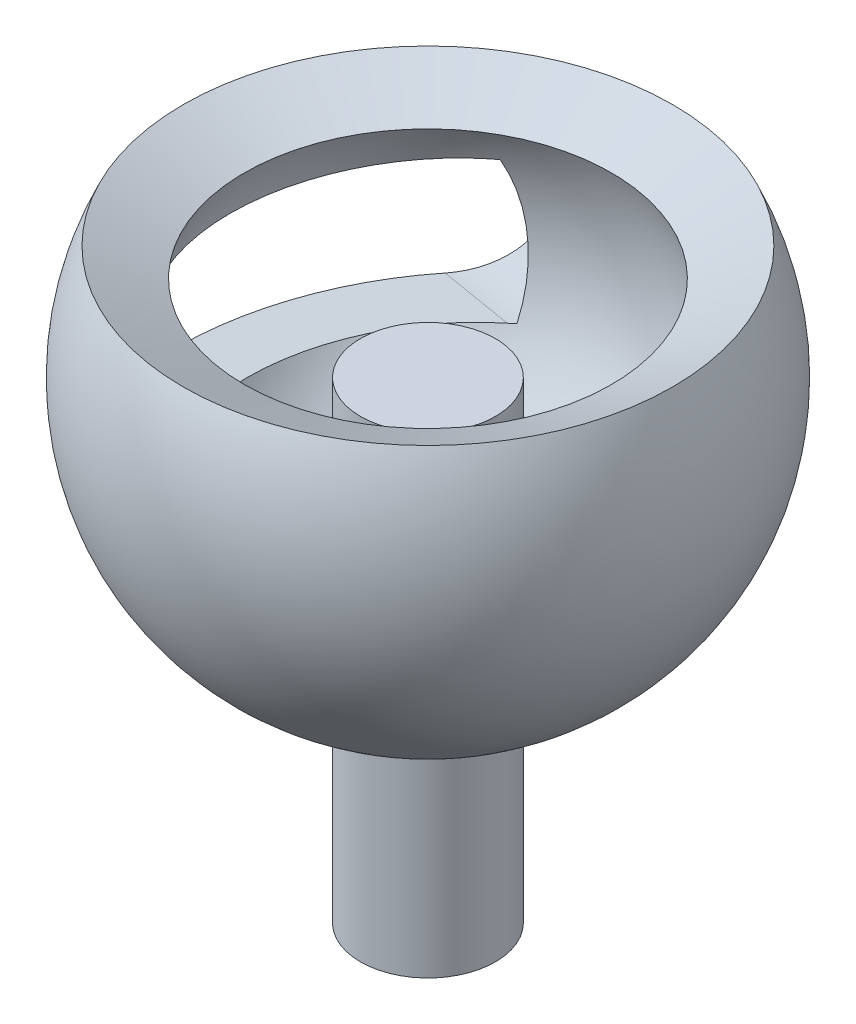
ISO-10303-21;
HEADER;
FILE_DESCRIPTION(('STEP AP214'),'2;1');
FILE_NAME('part.step','',(''),(''),'','','');
FILE_SCHEMA(('AUTOMOTIVE_DESIGN { 1 0 10303 214 1 1 1 1 }'));
ENDSEC;
DATA;
#1=APPLICATION_CONTEXT('core data for automotive mechanical design processes');
#2=APPLICATION_PROTOCOL_DEFINITION('international standard','automotive_design',2000,#1);
#3=PRODUCT_CONTEXT('',#1,'mechanical');
#4=PRODUCT('Part','Part','',(#3));
#5=PRODUCT_RELATED_PRODUCT_CATEGORY('part','',(#4));
#6=PRODUCT_DEFINITION_FORMATION('','',#4);
#7=PRODUCT_DEFINITION_CONTEXT('part definition',#1,'design');
#8=PRODUCT_DEFINITION('design','',#6,#7);
#9=PRODUCT_DEFINITION_SHAPE('','',#8);
#10=(LENGTH_UNIT() NAMED_UNIT(*) SI_UNIT(.MILLI.,.METRE.));
#11=(NAMED_UNIT(*) PLANE_ANGLE_UNIT() SI_UNIT($,.RADIAN.));
#12=(NAMED_UNIT(*) SI_UNIT($,.STERADIAN.) SOLID_ANGLE_UNIT());
#13=UNCERTAINTY_MEASURE_WITH_UNIT(LENGTH_MEASURE(1.E-05),#10,'distance_accuracy_value','');
#14=(GEOMETRIC_REPRESENTATION_CONTEXT(3) GLOBAL_UNCERTAINTY_ASSIGNED_CONTEXT((#13)) GLOBAL_UNIT_ASSIGNED_CONTEXT((#10,
#11,#12)) REPRESENTATION_CONTEXT('',''));
#15=CARTESIAN_POINT('',(0.,0.,0.));
#16=DIRECTION('',(0.,0.,1.));
#17=DIRECTION('',(1.,0.,0.));
#18=AXIS2_PLACEMENT_3D('',#15,#16,#17);
#19=CARTESIAN_POINT('',(0.,0.,0.));
#20=DIRECTION('',(0.,1.,0.));
#21=DIRECTION('',(1.,0.,0.));
#22=AXIS2_PLACEMENT_3D('',#19,#20,#21);
#23=SPHERICAL_SURFACE('',#22,6.);
#24=CARTESIAN_POINT('',(-2.62167369861936,-2.3424846293305,-4.86205643522551));
#25=CARTESIAN_POINT('',(-2.57683275353672,-2.33793647134456,-4.88842684763844));
#26=CARTESIAN_POINT('',(-2.53192803712261,-2.3323285090776,-4.91450016644448));
#27=CARTESIAN_POINT('',(-2.44210939386938,-2.31909401395078,-4.96594618772946));
#28=CARTESIAN_POINT('',(-2.39719559201061,-2.31147066182376,-4.99131992522537));
#29=CARTESIAN_POINT('',(-2.30733717378224,-2.29429178422087,-5.0413429190142));
#30=CARTESIAN_POINT('',(-2.26239255816846,-2.28473630455975,-5.06599219246979));
#31=CARTESIAN_POINT('',(-2.17244104196638,-2.26376357330472,-5.11454805890817));
#32=CARTESIAN_POINT('',(-2.12743415447295,-2.25234341999982,-5.13845342410275));
#33=CARTESIAN_POINT('',(-2.0824516416394,-2.24004140477855,-5.16193855689034));
#34=B_SPLINE_CURVE_WITH_KNOTS('',3,(#24,#25,#26,#27,#28,#29,#30,#31,#32,#33),.UNSPECIFIED.,.F.,
.F.,(4,2,2,2,4),(0.,0.156640281688716,0.313034810921426,0.469425632150523,0.626062181831317),.UNSPECIFIED.);
#35=CARTESIAN_POINT('',(-2.5533300558906,-2.33474380231328,-4.90198704641755));
#36=VERTEX_POINT('',#35);
#37=CARTESIAN_POINT('',(-2.36885059175089,-2.30600792023142,-5.00708241851394));
#38=VERTEX_POINT('',#37);
#39=EDGE_CURVE('E95',#36,#38,#34,.T.);
#40=ORIENTED_EDGE('',*,*,#39,.F.);
#41=CARTESIAN_POINT('',(0.248078612385995,-1.984554610505,0.));
#42=DIRECTION('',(0.124039306192997,-0.992277305252498,0.));
#43=DIRECTION('',(0.992277305252498,0.124039306192997,0.));
#44=AXIS2_PLACEMENT_3D('',#41,#42,#43);
#45=CIRCLE('',#44,5.65685424949238);
#46=CARTESIAN_POINT('',(-4.61605188441586,-2.59259368270969,2.82321146865667));
#47=VERTEX_POINT('',#46);
#48=EDGE_CURVE('E82',#47,#36,#45,.T.);
#49=ORIENTED_EDGE('',*,*,#48,.F.);
#50=CARTESIAN_POINT('',(-4.4693442193253,-2.56375979272113,3.07442644641404));
#51=CARTESIAN_POINT('',(-4.51198223146642,-2.5750277431296,3.00304346858877));
#52=CARTESIAN_POINT('',(-4.55414825488242,-2.58378865696318,2.93100553495964));
#53=CARTESIAN_POINT('',(-4.6375728451934,-2.59593490315072,2.78587535304215));
#54=CARTESIAN_POINT('',(-4.67883056843072,-2.59931542991384,2.71278222100469));
#55=CARTESIAN_POINT('',(-4.80197171622592,-2.60082891893815,2.49107787800528));
#56=CARTESIAN_POINT('',(-4.88239774743434,-2.59010033691617,2.3414354305859));
#57=CARTESIAN_POINT('',(-5.03072702162718,-2.5445611714823,2.0591892981356));
#58=CARTESIAN_POINT('',(-5.09907094296285,-2.51231785246034,1.92640416983957));
#59=CARTESIAN_POINT('',(-5.23117201891643,-2.42453723895334,1.66713778518798));
#60=CARTESIAN_POINT('',(-5.29495438059619,-2.369141792985,1.54062330230016));
#61=CARTESIAN_POINT('',(-5.38981991142038,-2.26408426524728,1.35305763573868));
#62=CARTESIAN_POINT('',(-5.4227445388729,-2.22298322007234,1.28808340304517));
#63=CARTESIAN_POINT('',(-5.48690895696774,-2.13300637684664,1.1623890802866));
#64=CARTESIAN_POINT('',(-5.51814109091605,-2.08409865141308,1.10168800276022));
#65=CARTESIAN_POINT('',(-5.54835085632141,-2.0313188470059,1.04381344930794));
#66=B_SPLINE_CURVE_WITH_KNOTS('',3,(#50,#51,#52,#53,#54,#55,#56,#57,#58,#59,#60,#61,#62,#63,#64,
#65),.UNSPECIFIED.,.F.,.F.,(4,2,2,2,2,2,2,4),(0.,0.251632302239745,0.503489228586969,
1.01207278899626,1.46879476360035,1.92275858840497,2.17322778125711,2.42474889223318),.UNSPECIFIED.);
#67=CARTESIAN_POINT('',(-4.50891301326772,-2.57352573664173,3.00776806313713));
#68=VERTEX_POINT('',#67);
#69=EDGE_CURVE('E89',#68,#47,#66,.T.);
#70=ORIENTED_EDGE('',*,*,#69,.F.);
#71=CARTESIAN_POINT('',(-3.68626191744866,-0.460799988335568,-0.999657177688405));
#72=DIRECTION('',(-0.958192395634806,-0.119778533001622,-0.259846947220109));
#73=DIRECTION('',(-0.261731245703058,0.,0.965140795440088));
#74=AXIS2_PLACEMENT_3D('',#71,#72,#73);
#75=CIRCLE('',#74,4.6043264408395);
#76=CARTESIAN_POINT('',(-5.00367324314643,1.38440794356029,3.00776806313713));
#77=VERTEX_POINT('',#76);
#78=EDGE_CURVE('E34',#68,#77,#75,.T.);
#79=ORIENTED_EDGE('',*,*,#78,.T.);
#80=CARTESIAN_POINT('',(-5.87765487203645,0.603014666712204,1.04381344930795));
#81=CARTESIAN_POINT('',(-5.85020883766115,0.701838441194811,1.14143467568126));
#82=CARTESIAN_POINT('',(-5.81726149384555,0.790501199119532,1.24684899162035));
#83=CARTESIAN_POINT('',(-5.74192924146358,0.947223116031309,1.46708353672751));
#84=CARTESIAN_POINT('',(-5.69966119824299,1.01551470807885,1.58177703292805));
#85=CARTESIAN_POINT('',(-5.59578045140536,1.14717327683701,1.84413049345374));
#86=CARTESIAN_POINT('',(-5.53195464095308,1.20575011356224,1.99328091186678));
#87=CARTESIAN_POINT('',(-5.39240419307753,1.29772025804248,2.29519460044161));
#88=CARTESIAN_POINT('',(-5.31658365922568,1.3308968033695,2.44797774025803));
#89=CARTESIAN_POINT('',(-5.18008080793089,1.36751427442479,2.703866841102));
#90=CARTESIAN_POINT('',(-5.12205214503806,1.37700208116462,2.80760508826997));
#91=CARTESIAN_POINT('',(-5.0014840557169,1.38610426252,3.01298406744681));
#92=CARTESIAN_POINT('',(-4.93894110337153,1.38571083426945,3.11462307837695));
#93=CARTESIAN_POINT('',(-4.81062805948987,1.37604929011073,3.31333032781065));
#94=CARTESIAN_POINT('',(-4.74491637836498,1.36690722769587,3.41044296799464));
#95=CARTESIAN_POINT('',(-4.6098330365706,1.34081664374517,3.60075484565264));
#96=CARTESIAN_POINT('',(-4.54046799168121,1.3238818308014,3.693960642968));
#97=CARTESIAN_POINT('',(-4.4693442193256,1.30347494444054,3.78495909071692));
#98=B_SPLINE_CURVE_WITH_KNOTS('',3,(#80,#81,#82,#83,#84,#85,#86,#87,#88,#89,#90,#91,#92,#93,#94,
#95,#96,#97),.UNSPECIFIED.,.F.,.F.,(4,2,2,2,2,2,2,2,4),(0.,0.423156860718995,0.841282598925935,
1.35609216159077,1.87524751958704,2.23248928920844,2.59001316903957,2.94246207678071,
3.2942933315326),.UNSPECIFIED.);
#99=CARTESIAN_POINT('',(-5.11220910918785,1.3765155383003,2.82321146865667));
#100=VERTEX_POINT('',#99);
#101=EDGE_CURVE('E167',#100,#77,#98,.T.);
#102=ORIENTED_EDGE('',*,*,#101,.F.);
#103=CARTESIAN_POINT('',(-0.248078612385995,1.984554610505,0.));
#104=DIRECTION('',(-0.124039306192997,0.992277305252498,0.));
#105=DIRECTION('',(-0.992277305252498,-0.124039306192997,0.));
#106=AXIS2_PLACEMENT_3D('',#103,#104,#105);
#107=CIRCLE('',#106,5.65685424949238);
#108=CARTESIAN_POINT('',(-3.04948728066259,1.63436541869671,-4.90198704641755));
#109=VERTEX_POINT('',#108);
#110=EDGE_CURVE('E110',#109,#100,#107,.T.);
#111=ORIENTED_EDGE('',*,*,#110,.F.);
#112=CARTESIAN_POINT('',(-2.83024118372822,1.65392622405384,-5.02536196580064));
#113=CARTESIAN_POINT('',(-2.87878254259309,1.65129257484225,-4.99888980655007));
#114=CARTESIAN_POINT('',(-2.92700257259037,1.64756893056397,-4.97204493271159));
#115=CARTESIAN_POINT('',(-3.02279997485937,1.63794165187304,-4.91760975585337));
#116=CARTESIAN_POINT('',(-3.07037734713096,1.63203801745996,-4.89001945283347));
#117=CARTESIAN_POINT('',(-3.11763339053483,1.62504438797974,-4.86205643522552));
#118=B_SPLINE_CURVE_WITH_KNOTS('',3,(#112,#113,#114,#115,#116,#117),.UNSPECIFIED.,.F.,.F.,(4,2,
4),(0.,0.165943233183761,0.331886466400857),.UNSPECIFIED.);
#119=CARTESIAN_POINT('',(-2.86361082162961,1.65192575997059,-5.00708241851394));
#120=VERTEX_POINT('',#119);
#121=EDGE_CURVE('E105',#120,#109,#118,.T.);
#122=ORIENTED_EDGE('',*,*,#121,.F.);
#123=EDGE_CURVE('E11',#120,#38,#75,.T.);
#124=ORIENTED_EDGE('',*,*,#123,.T.);
#125=EDGE_LOOP('',(#40,#49,#70,#79,#102,#111,#122,#124));
#126=FACE_BOUND('',#125,.T.);
#127=CARTESIAN_POINT('',(0.,-5.65685424949238,0.));
#128=DIRECTION('',(0.,1.,0.));
#129=DIRECTION('',(0.,0.,1.));
#130=AXIS2_PLACEMENT_3D('',#127,#128,#129);
#131=CIRCLE('',#130,2.);
#132=CARTESIAN_POINT('',(0.,-5.65685424949238,2.));
#133=VERTEX_POINT('',#132);
#134=EDGE_CURVE('E218',#133,#133,#131,.T.);
#135=ORIENTED_EDGE('',*,*,#134,.F.);
#136=EDGE_LOOP('',(#135));
#137=FACE_BOUND('',#136,.T.);
#138=CARTESIAN_POINT('',(0.,2.53570957044419,0.));
#139=DIRECTION('',(0.,1.,0.));
#140=DIRECTION('',(0.,0.,1.));
#141=AXIS2_PLACEMENT_3D('',#138,#139,#140);
#142=CIRCLE('',#141,5.4378467222199);
#143=CARTESIAN_POINT('',(0.,2.53570957044419,5.4378467222199));
#144=VERTEX_POINT('',#143);
#145=EDGE_CURVE('E213',#144,#144,#142,.T.);
#146=ORIENTED_EDGE('',*,*,#145,.T.);
#147=EDGE_LOOP('',(#146));
#148=FACE_BOUND('',#147,.T.);
#149=ADVANCED_FACE('F30',(#126,#137,#148),#23,.F.);
#150=CARTESIAN_POINT('',(0.,2.53570957044419,0.));
#151=DIRECTION('',(0.,1.,0.));
#152=DIRECTION('',(0.,0.,1.));
#153=AXIS2_PLACEMENT_3D('',#150,#151,#152);
#154=CONICAL_SURFACE('',#153,5.4378467222199,1.13446401379632);
#155=CARTESIAN_POINT('',(0.,3.38094609392559,0.));
#156=DIRECTION('',(0.,1.,0.));
#157=DIRECTION('',(0.,0.,1.));
#158=AXIS2_PLACEMENT_3D('',#155,#156,#157);
#159=CIRCLE('',#158,7.25046229629321);
#160=CARTESIAN_POINT('',(0.,3.38094609392559,7.25046229629321));
#161=VERTEX_POINT('',#160);
#162=EDGE_CURVE('E210',#161,#161,#159,.T.);
#163=ORIENTED_EDGE('',*,*,#162,.T.);
#164=EDGE_LOOP('',(#163));
#165=FACE_BOUND('',#164,.T.);
#166=ORIENTED_EDGE('',*,*,#145,.F.);
#167=EDGE_LOOP('',(#166));
#168=FACE_BOUND('',#167,.T.);
#169=ADVANCED_FACE('F143',(#165,#168),#154,.F.);
#170=CARTESIAN_POINT('',(0.,0.,0.));
#171=DIRECTION('',(0.,1.,0.));
#172=DIRECTION('',(-1.,0.,0.));
#173=AXIS2_PLACEMENT_3D('',#170,#171,#172);
#174=SPHERICAL_SURFACE('',#173,8.);
#175=CARTESIAN_POINT('',(-6.27027160707574,1.02181270014713,-4.86205643522551));
#176=CARTESIAN_POINT('',(-6.21983922596498,1.0625291980412,-4.91853759971496));
#177=CARTESIAN_POINT('',(-6.1674823210125,1.09920992402776,-4.97606924910927));
#178=CARTESIAN_POINT('',(-6.05948490672703,1.16447325683609,-5.09254589186676));
#179=CARTESIAN_POINT('',(-6.00384668199067,1.19306141946561,-5.15148988530836));
#180=CARTESIAN_POINT('',(-5.8334357381382,1.26642705261333,-5.32881456663511));
#181=CARTESIAN_POINT('',(-5.71454648756449,1.29929543472618,-5.44838376853232));
#182=CARTESIAN_POINT('',(-5.48970293245135,1.33068571821239,-5.66686133364708));
#183=CARTESIAN_POINT('',(-5.38462196089303,1.33376368607654,-5.76608440109681));
#184=CARTESIAN_POINT('',(-5.17240547349796,1.31770879008165,-5.96075939625274));
#185=CARTESIAN_POINT('',(-5.06526782758952,1.29855152444273,-6.05620706172493));
#186=CARTESIAN_POINT('',(-4.84430912956164,1.23605080797928,-6.24729564711139));
#187=CARTESIAN_POINT('',(-4.73054404206126,1.19111122986905,-6.34248425785919));
#188=CARTESIAN_POINT('',(-4.5077997204282,1.07600967511466,-6.52270782967073));
#189=CARTESIAN_POINT('',(-4.39881596242133,1.005872143493,-6.60775252540127));
#190=CARTESIAN_POINT('',(-4.21523878611866,0.860080513305835,-6.74580846429676));
#191=CARTESIAN_POINT('',(-4.13860553659886,0.789649017921226,-6.80163993849243));
#192=CARTESIAN_POINT('',(-3.99390089934421,0.634442215086632,-6.90362559484612));
#193=CARTESIAN_POINT('',(-3.92581803562073,0.549686499551378,-6.94979280474882));
#194=CARTESIAN_POINT('',(-3.81164375806775,0.38151432417256,-7.02392904888515));
#195=CARTESIAN_POINT('',(-3.76377652098153,0.300072016537706,-7.05363036277467));
#196=CARTESIAN_POINT('',(-3.67877004206897,0.129035868450764,-7.1035009533797));
#197=CARTESIAN_POINT('',(-3.64162486288628,0.0394465756903409,-7.1236755095037));
#198=CARTESIAN_POINT('',(-3.58000102995091,-0.146227181802615,-7.15346417660262));
#199=CARTESIAN_POINT('',(-3.55558790117714,-0.242342424388838,-7.16302393794755));
#200=CARTESIAN_POINT('',(-3.52115100365416,-0.437560111287204,-7.17076478028338));
#201=CARTESIAN_POINT('',(-3.5111228636723,-0.536661638793174,-7.16894931881607));
#202=CARTESIAN_POINT('',(-3.50589793425003,-0.725722548732182,-7.15473312017832));
#203=CARTESIAN_POINT('',(-3.50948284935211,-0.815724792689759,-7.14327026865928));
#204=CARTESIAN_POINT('',(-3.52809146074904,-0.992938611914795,-7.11159853237167));
#205=CARTESIAN_POINT('',(-3.54311699545404,-1.0801497363259,-7.09138824218946));
#206=CARTESIAN_POINT('',(-3.58422786842034,-1.25352972832116,-7.04207950519302));
#207=CARTESIAN_POINT('',(-3.61076150155495,-1.33949208310117,-7.01263586643444));
#208=CARTESIAN_POINT('',(-3.67325022036234,-1.50485057757019,-6.9463357315395));
#209=CARTESIAN_POINT('',(-3.70920938533991,-1.58424385458615,-6.90947602739074));
#210=CARTESIAN_POINT('',(-3.7952072414312,-1.74744772762155,-6.82310496878815));
#211=CARTESIAN_POINT('',(-3.84657116806696,-1.82998667674364,-6.7725154357396));
#212=CARTESIAN_POINT('',(-3.95753262208518,-1.98417426031758,-6.66430488765083));
#213=CARTESIAN_POINT('',(-4.01713510531834,-2.05581628489822,-6.60667964277677));
#214=CARTESIAN_POINT('',(-4.1545768877598,-2.2001077116425,-6.47424738605533));
#215=CARTESIAN_POINT('',(-4.23373718210739,-2.27040858432215,-6.39824791433562));
#216=CARTESIAN_POINT('',(-4.39860611598217,-2.39426353723545,-6.23992771513736));
#217=CARTESIAN_POINT('',(-4.48431985235604,-2.4478044143328,-6.15760206730851));
#218=CARTESIAN_POINT('',(-4.67258979828391,-2.54381362643256,-5.97644434221601));
#219=CARTESIAN_POINT('',(-4.7758204137415,-2.58366953569268,-5.87691819564813));
#220=CARTESIAN_POINT('',(-4.98529192085945,-2.63978183990619,-5.67454239165693));
#221=CARTESIAN_POINT('',(-5.09153163874935,-2.65604731104828,-5.57169402800137));
#222=CARTESIAN_POINT('',(-5.30394492601083,-2.66396395119735,-5.36592675378921));
#223=CARTESIAN_POINT('',(-5.41011618314648,-2.65573746520686,-5.26301075281664));
#224=CARTESIAN_POINT('',(-5.62033279015752,-2.61403527174674,-5.05971619931296));
#225=CARTESIAN_POINT('',(-5.72437255075668,-2.58050020620549,-4.95934418626882));
#226=CARTESIAN_POINT('',(-5.82579369899815,-2.53387746297953,-4.86205643522552));
#227=B_SPLINE_CURVE_WITH_KNOTS('',3,(#175,#176,#177,#178,#179,#180,#181,#182,#183,#184,#185,
#186,#187,#188,#189,#190,#191,#192,#193,#194,#195,#196,#197,#198,#199,#200,#201,#202,#203,#204,
#205,#206,#207,#208,#209,#210,#211,#212,#213,#214,#215,#216,#217,#218,#219,#220,#221,#222,#223,
#224,#225,#226),.UNSPECIFIED.,.F.,.F.,(4,2,2,2,2,2,2,2,2,2,2,2,2,2,2,2,2,2,2,2,2,2,2,2,2,4),(0.,
0.25763247582187,0.515087647218539,1.02689550283173,1.4589059312817,1.89139091282403,
2.35408881027128,2.81633904227491,3.16932702114654,3.52183605201909,3.81768875083144,
4.11337730507195,4.41057295415718,4.70767827388955,4.97884752760406,5.25006036510723,
5.53294939268135,5.81596105539989,6.14351852721897,6.47127390364718,6.86072056706931,
7.25047325992718,7.69498356887933,8.13932281145911,8.58144617052889,9.02460970907737),.UNSPECIFIED.);
#228=CARTESIAN_POINT('',(-5.57264700470822,1.31895864689203,-5.58622891123388));
#229=VERTEX_POINT('',#228);
#230=CARTESIAN_POINT('',(-5.07648977993623,-2.65015057411796,-5.58622891123388));
#231=VERTEX_POINT('',#230);
#232=EDGE_CURVE('E99',#229,#231,#227,.T.);
#233=ORIENTED_EDGE('',*,*,#232,.F.);
#234=CARTESIAN_POINT('',(-0.248078612385995,1.984554610505,0.));
#235=DIRECTION('',(-0.124039306192997,0.992277305252498,0.));
#236=DIRECTION('',(-0.992277305252498,-0.124039306192997,0.));
#237=AXIS2_PLACEMENT_3D('',#234,#235,#236);
#238=CIRCLE('',#237,7.74596669241483);
#239=CARTESIAN_POINT('',(-7.63536883323344,1.06110876649563,2.13896960384035));
#240=VERTEX_POINT('',#239);
#241=EDGE_CURVE('E137',#240,#229,#238,.F.);
#242=ORIENTED_EDGE('',*,*,#241,.F.);
#243=CARTESIAN_POINT('',(-7.46188805534335,-2.68899240098743,1.04381344930794));
#244=CARTESIAN_POINT('',(-7.42328786264489,-2.74786409939674,1.16834256692538));
#245=CARTESIAN_POINT('',(-7.38410518442597,-2.79476863286955,1.29800900108845));
#246=CARTESIAN_POINT('',(-7.30540687998748,-2.86496718669333,1.56304447910053));
#247=CARTESIAN_POINT('',(-7.26589273657821,-2.8883369239375,1.6983937663562));
#248=CARTESIAN_POINT('',(-7.18718647802485,-2.91213929608173,1.97079915568269));
#249=CARTESIAN_POINT('',(-7.14799386695407,-2.91261911534248,2.10785116406474));
#250=CARTESIAN_POINT('',(-7.07052585913843,-2.89146410413003,2.38061347244262));
#251=CARTESIAN_POINT('',(-7.03225135669412,-2.86980854152115,2.51632239418664));
#252=CARTESIAN_POINT('',(-6.95468636562359,-2.80258953824157,2.79306423049855));
#253=CARTESIAN_POINT('',(-6.91553476605921,-2.75535572051375,2.93373373733052));
#254=CARTESIAN_POINT('',(-6.84064245418976,-2.63677439127518,3.20568978134413));
#255=CARTESIAN_POINT('',(-6.80490421609591,-2.56540955573262,3.336969495183));
#256=CARTESIAN_POINT('',(-6.73916953346035,-2.40033636832296,3.58397240296002));
#257=CARTESIAN_POINT('',(-6.7091090126961,-2.30690799735784,3.6998641860555));
#258=CARTESIAN_POINT('',(-6.65682029716356,-2.0984277317108,3.91229394107538));
#259=CARTESIAN_POINT('',(-6.63457170965692,-1.983433357876,4.00888201593307));
#260=CARTESIAN_POINT('',(-6.60671464264743,-1.77581830502543,4.14825138342831));
#261=CARTESIAN_POINT('',(-6.59803467057778,-1.68842470909654,4.1982540179696));
#262=CARTESIAN_POINT('',(-6.58668881403088,-1.50665083661938,4.28434929350008));
#263=CARTESIAN_POINT('',(-6.58401747310194,-1.41227697938507,4.32045453002677));
#264=CARTESIAN_POINT('',(-6.58557524874247,-1.21826123828463,4.37679196755608));
#265=CARTESIAN_POINT('',(-6.58984685114153,-1.11859055692454,4.39692530857941));
#266=CARTESIAN_POINT('',(-6.60577515287143,-0.917837798371729,4.41945260357795));
#267=CARTESIAN_POINT('',(-6.61742871791831,-0.81675633798173,4.42185408079441));
#268=CARTESIAN_POINT('',(-6.64623295078313,-0.626859432444022,4.4094171957385));
#269=CARTESIAN_POINT('',(-6.66271992960499,-0.537825612974584,4.39627332526906));
#270=CARTESIAN_POINT('',(-6.70062214983492,-0.363999877947914,4.35631482219998));
#271=CARTESIAN_POINT('',(-6.7220379303688,-0.279208427668718,4.32949869370108));
#272=CARTESIAN_POINT('',(-6.76924314281307,-0.114097547433038,4.26297759647475));
#273=CARTESIAN_POINT('',(-6.79511125134265,-0.0339009605604129,4.22302635025913));
#274=CARTESIAN_POINT('',(-6.84977777734475,0.118912043538739,4.13219815414631));
#275=CARTESIAN_POINT('',(-6.87857730806855,0.191525559612678,4.08131704526433));
#276=CARTESIAN_POINT('',(-6.94240321681726,0.338447028420339,3.96230204290308));
#277=CARTESIAN_POINT('',(-6.97772561978185,0.411461679119977,3.89273470934174));
#278=CARTESIAN_POINT('',(-7.04955215646084,0.546134897899738,3.74391946699637));
#279=CARTESIAN_POINT('',(-7.08605702768061,0.607786211838028,3.66466542771399));
#280=CARTESIAN_POINT('',(-7.16613666125494,0.730094462973763,3.48274327276525));
#281=CARTESIAN_POINT('',(-7.2097438270028,0.788361882578422,3.37848075083046));
#282=CARTESIAN_POINT('',(-7.29583753125855,0.888387064267433,3.16190321754921));
#283=CARTESIAN_POINT('',(-7.33832346845291,0.930136129012648,3.04958400081204));
#284=CARTESIAN_POINT('',(-7.4274390810156,1.00200709864378,2.80186389389471));
#285=CARTESIAN_POINT('',(-7.47372218385791,1.02941147651396,2.66554310709902));
#286=CARTESIAN_POINT('',(-7.56225340429591,1.06168086520108,2.38883825663396));
#287=CARTESIAN_POINT('',(-7.60449721724657,1.06652208714576,2.2484500613883));
#288=CARTESIAN_POINT('',(-7.686136712897,1.0527222689205,1.959326899452));
#289=CARTESIAN_POINT('',(-7.72523513872302,1.03273435050105,1.81056996245844));
#290=CARTESIAN_POINT('',(-7.7965891529204,0.966367127612591,1.51757733991611));
#291=CARTESIAN_POINT('',(-7.82886386785586,0.920062968954062,1.37333000924196));
#292=CARTESIAN_POINT('',(-7.86382392183498,0.846846672479052,1.20183718233047));
#293=CARTESIAN_POINT('',(-7.87020203573182,0.832341024091855,1.16979108251103));
#294=CARTESIAN_POINT('',(-7.88252623109327,0.80192834052049,1.10632750200123));
#295=CARTESIAN_POINT('',(-7.88847274381181,0.786022740338801,1.07490941720253));
#296=CARTESIAN_POINT('',(-7.89420441152597,0.769408988826968,1.04381344930794));
#297=B_SPLINE_CURVE_WITH_KNOTS('',3,(#243,#244,#245,#246,#247,#248,#249,#250,#251,#252,#253,
#254,#255,#256,#257,#258,#259,#260,#261,#262,#263,#264,#265,#266,#267,#268,#269,#270,#271,#272,
#273,#274,#275,#276,#277,#278,#279,#280,#281,#282,#283,#284,#285,#286,#287,#288,#289,#290,#291,
#292,#293,#294,#295,#296),.UNSPECIFIED.,.F.,.F.,(4,2,2,2,2,2,2,2,2,2,2,2,2,2,2,2,2,2,2,2,2,2,2,
2,2,2,4),(0.,0.428146701791614,0.854911513165739,1.2807965705457,1.7070808803359,
2.16531791786193,2.62388463180324,3.07691839134135,3.52876057488793,3.83075860577745,
4.13248228065313,4.43605924876496,4.73950740841647,5.01270992074159,5.28594233092019,
5.56462152057041,5.84340694047664,6.1627928606501,6.48238196994365,6.86236465807742,
7.24254715147954,7.680292479825,8.11849922923925,8.58154993065691,9.0432849905206,
9.15051235658835,9.25763106293286),.UNSPECIFIED.);
#298=CARTESIAN_POINT('',(-7.13921160846149,-2.90800045451437,2.13896960384034));
#299=VERTEX_POINT('',#298);
#300=EDGE_CURVE('E147',#299,#240,#297,.T.);
#301=ORIENTED_EDGE('',*,*,#300,.F.);
#302=CARTESIAN_POINT('',(0.248078612385995,-1.984554610505,0.));
#303=DIRECTION('',(0.124039306192997,-0.992277305252498,0.));
#304=DIRECTION('',(0.992277305252498,0.124039306192997,0.));
#305=AXIS2_PLACEMENT_3D('',#302,#303,#304);
#306=CIRCLE('',#305,7.74596669241483);
#307=EDGE_CURVE('E152',#231,#299,#306,.F.);
#308=ORIENTED_EDGE('',*,*,#307,.F.);
#309=EDGE_LOOP('',(#233,#242,#301,#308));
#310=FACE_BOUND('',#309,.T.);
#311=CARTESIAN_POINT('',(0.,-7.74596669241483,0.));
#312=DIRECTION('',(0.,1.,0.));
#313=DIRECTION('',(0.,0.,1.));
#314=AXIS2_PLACEMENT_3D('',#311,#312,#313);
#315=CIRCLE('',#314,2.);
#316=CARTESIAN_POINT('',(0.,-7.74596669241483,2.));
#317=VERTEX_POINT('',#316);
#318=EDGE_CURVE('E215',#317,#317,#315,.F.);
#319=ORIENTED_EDGE('',*,*,#318,.F.);
#320=EDGE_LOOP('',(#319));
#321=FACE_BOUND('',#320,.T.);
#322=ORIENTED_EDGE('',*,*,#162,.F.);
#323=EDGE_LOOP('',(#322));
#324=FACE_BOUND('',#323,.T.);
#325=ADVANCED_FACE('F139',(#310,#321,#324),#174,.T.);
#326=CARTESIAN_POINT('',(0.,-14.,0.));
#327=DIRECTION('',(0.,1.,0.));
#328=DIRECTION('',(0.,0.,1.));
#329=AXIS2_PLACEMENT_3D('',#326,#327,#328);
#330=PLANE('',#329);
#331=CARTESIAN_POINT('',(0.,-14.,0.));
#332=DIRECTION('',(0.,1.,0.));
#333=DIRECTION('',(0.,0.,1.));
#334=AXIS2_PLACEMENT_3D('',#331,#332,#333);
#335=CIRCLE('',#334,2.);
#336=CARTESIAN_POINT('',(0.,-14.,2.));
#337=VERTEX_POINT('',#336);
#338=EDGE_CURVE('E108',#337,#337,#335,.T.);
#339=ORIENTED_EDGE('',*,*,#338,.F.);
#340=EDGE_LOOP('',(#339));
#341=FACE_BOUND('',#340,.T.);
#342=ADVANCED_FACE('F128',(#341),#330,.F.);
#343=CARTESIAN_POINT('',(0.,-14.,0.));
#344=DIRECTION('',(0.,1.,0.));
#345=DIRECTION('',(0.,0.,1.));
#346=AXIS2_PLACEMENT_3D('',#343,#344,#345);
#347=CYLINDRICAL_SURFACE('',#346,2.);
#348=ORIENTED_EDGE('',*,*,#318,.T.);
#349=EDGE_LOOP('',(#348));
#350=FACE_BOUND('',#349,.T.);
#351=ORIENTED_EDGE('',*,*,#338,.T.);
#352=EDGE_LOOP('',(#351));
#353=FACE_BOUND('',#352,.T.);
#354=ADVANCED_FACE('F145',(#350,#353),#347,.T.);
#355=ORIENTED_EDGE('',*,*,#134,.T.);
#356=EDGE_LOOP('',(#355));
#357=FACE_BOUND('',#356,.T.);
#358=CARTESIAN_POINT('',(0.,0.,0.));
#359=DIRECTION('',(0.,1.,0.));
#360=DIRECTION('',(0.,0.,1.));
#361=AXIS2_PLACEMENT_3D('',#358,#359,#360);
#362=CIRCLE('',#361,2.);
#363=CARTESIAN_POINT('',(0.,0.,2.));
#364=VERTEX_POINT('',#363);
#365=EDGE_CURVE('E104',#364,#364,#362,.T.);
#366=ORIENTED_EDGE('',*,*,#365,.F.);
#367=EDGE_LOOP('',(#366));
#368=FACE_BOUND('',#367,.T.);
#369=ADVANCED_FACE('F195',(#357,#368),#347,.T.);
#370=CARTESIAN_POINT('',(0.,0.,0.));
#371=DIRECTION('',(0.,1.,0.));
#372=DIRECTION('',(0.,0.,1.));
#373=AXIS2_PLACEMENT_3D('',#370,#371,#372);
#374=PLANE('',#373);
#375=ORIENTED_EDGE('',*,*,#365,.T.);
#376=EDGE_LOOP('',(#375));
#377=FACE_BOUND('',#376,.T.);
#378=ADVANCED_FACE('F191',(#377),#374,.T.);
#379=CARTESIAN_POINT('',(-2.65490100318603,-0.331875048137365,-4.86225643522551));
#380=DIRECTION('',(-0.958192395634806,-0.119778533001622,-0.259846947220109));
#381=DIRECTION('',(-0.261731245703058,0.,0.965140795440088));
#382=AXIS2_PLACEMENT_3D('',#379,#380,#381);
#383=PLANE('',#382);
#384=CARTESIAN_POINT('',(-2.65490100318603,-0.331875048137365,-4.86225643522551));
#385=DIRECTION('',(-0.958192395634806,-0.119778533001622,-0.259846947220109));
#386=DIRECTION('',(-0.261731245703058,0.,0.965140795440088));
#387=AXIS2_PLACEMENT_3D('',#384,#385,#386);
#388=CIRCLE('',#387,2.);
#389=EDGE_CURVE('E183',#120,#38,#388,.T.);
#390=ORIENTED_EDGE('',*,*,#389,.T.);
#391=ORIENTED_EDGE('',*,*,#123,.F.);
#392=EDGE_LOOP('',(#390,#391));
#393=FACE_BOUND('',#392,.T.);
#394=ADVANCED_FACE('F126',(#393),#383,.T.);
#395=CARTESIAN_POINT('',(-2.65490100318603,-0.331875048137365,-4.86225643522551));
#396=DIRECTION('',(-0.958192395634806,-0.119778533001622,-0.259846947220109));
#397=DIRECTION('',(-0.261731245703058,0.,0.965140795440088));
#398=AXIS2_PLACEMENT_3D('',#395,#396,#397);
#399=CYLINDRICAL_SURFACE('',#398,2.);
#400=ORIENTED_EDGE('',*,*,#39,.T.);
#401=ORIENTED_EDGE('',*,*,#389,.F.);
#402=ORIENTED_EDGE('',*,*,#121,.T.);
#403=DIRECTION('',(-0.958192395634806,-0.119778533001622,-0.259846947220109));
#404=VECTOR('',#403,1.);
#405=CARTESIAN_POINT('',(-2.90297961557202,1.65267956236763,-4.86225643522551));
#406=LINE('',#405,#404);
#407=EDGE_CURVE('E90',#109,#229,#406,.T.);
#408=ORIENTED_EDGE('',*,*,#407,.T.);
#409=ORIENTED_EDGE('',*,*,#232,.T.);
#410=DIRECTION('',(-0.958192395634806,-0.119778533001622,-0.259846947220109));
#411=VECTOR('',#410,1.);
#412=CARTESIAN_POINT('',(-2.40682239080003,-2.31642965864236,-4.86225643522551));
#413=LINE('',#412,#411);
#414=EDGE_CURVE('E52',#36,#231,#413,.T.);
#415=ORIENTED_EDGE('',*,*,#414,.F.);
#416=EDGE_LOOP('',(#400,#401,#402,#408,#409,#415));
#417=FACE_BOUND('',#416,.T.);
#418=ADVANCED_FACE('F93',(#417),#399,.F.);
#419=CARTESIAN_POINT('',(-2.90297961557202,1.65267956236763,-4.86225643522551));
#420=DIRECTION('',(-0.124039306192997,0.992277305252498,0.));
#421=DIRECTION('',(-0.992277305252498,-0.124039306192997,0.));
#422=AXIS2_PLACEMENT_3D('',#419,#420,#421);
#423=PLANE('',#422);
#424=ORIENTED_EDGE('',*,*,#110,.T.);
#425=DIRECTION('',(-0.958192395634806,-0.119778533001622,-0.259846947220109));
#426=VECTOR('',#425,1.);
#427=CARTESIAN_POINT('',(-4.96570144409729,1.39482968197123,2.86294207984871));
#428=LINE('',#427,#426);
#429=EDGE_CURVE('E176',#100,#240,#428,.T.);
#430=ORIENTED_EDGE('',*,*,#429,.T.);
#431=ORIENTED_EDGE('',*,*,#241,.T.);
#432=ORIENTED_EDGE('',*,*,#407,.F.);
#433=EDGE_LOOP('',(#424,#430,#431,#432));
#434=FACE_BOUND('',#433,.T.);
#435=ADVANCED_FACE('F125',(#434),#423,.F.);
#436=CARTESIAN_POINT('',(-4.71762283171129,-0.589724928533771,2.86294207984871));
#437=DIRECTION('',(-0.958192395634806,-0.119778533001622,-0.259846947220109));
#438=DIRECTION('',(-0.261731245703058,0.,0.965140795440088));
#439=AXIS2_PLACEMENT_3D('',#436,#437,#438);
#440=CYLINDRICAL_SURFACE('',#439,2.);
#441=ORIENTED_EDGE('',*,*,#101,.T.);
#442=CARTESIAN_POINT('',(-4.71762283171129,-0.589724928533771,2.86294207984871));
#443=DIRECTION('',(-0.958192395634806,-0.119778533001622,-0.259846947220109));
#444=DIRECTION('',(0.261731245703058,0.,-0.965140795440088));
#445=AXIS2_PLACEMENT_3D('',#442,#443,#444);
#446=CIRCLE('',#445,2.);
#447=EDGE_CURVE('E44',#68,#77,#446,.T.);
#448=ORIENTED_EDGE('',*,*,#447,.F.);
#449=ORIENTED_EDGE('',*,*,#69,.T.);
#450=DIRECTION('',(-0.958192395634806,-0.119778533001622,-0.259846947220109));
#451=VECTOR('',#450,1.);
#452=CARTESIAN_POINT('',(-4.4695442193253,-2.57427953903877,2.86294207984871));
#453=LINE('',#452,#451);
#454=EDGE_CURVE('E85',#47,#299,#453,.T.);
#455=ORIENTED_EDGE('',*,*,#454,.T.);
#456=ORIENTED_EDGE('',*,*,#300,.T.);
#457=ORIENTED_EDGE('',*,*,#429,.F.);
#458=EDGE_LOOP('',(#441,#448,#449,#455,#456,#457));
#459=FACE_BOUND('',#458,.T.);
#460=ADVANCED_FACE('F154',(#459),#440,.F.);
#461=CARTESIAN_POINT('',(-2.40682239080003,-2.31642965864236,-4.86225643522551));
#462=DIRECTION('',(0.124039306192997,-0.992277305252498,0.));
#463=DIRECTION('',(0.992277305252498,0.124039306192997,0.));
#464=AXIS2_PLACEMENT_3D('',#461,#462,#463);
#465=PLANE('',#464);
#466=ORIENTED_EDGE('',*,*,#48,.T.);
#467=ORIENTED_EDGE('',*,*,#414,.T.);
#468=ORIENTED_EDGE('',*,*,#307,.T.);
#469=ORIENTED_EDGE('',*,*,#454,.F.);
#470=EDGE_LOOP('',(#466,#467,#468,#469));
#471=FACE_BOUND('',#470,.T.);
#472=ADVANCED_FACE('F83',(#471),#465,.F.);
#473=ORIENTED_EDGE('',*,*,#447,.T.);
#474=ORIENTED_EDGE('',*,*,#78,.F.);
#475=EDGE_LOOP('',(#473,#474));
#476=FACE_BOUND('',#475,.T.);
#477=ADVANCED_FACE('F182',(#476),#383,.T.);
#478=CLOSED_SHELL('',(#149,#169,#325,#342,#354,#369,#378,#394,#418,#435,#460,#472,#477));
#479=MANIFOLD_SOLID_BREP('B2',#478);
#480=ADVANCED_BREP_SHAPE_REPRESENTATION('',(#18,#479),#14);
#481=SHAPE_DEFINITION_REPRESENTATION(#9,#480);
ENDSEC;
END-ISO-10303-21;
